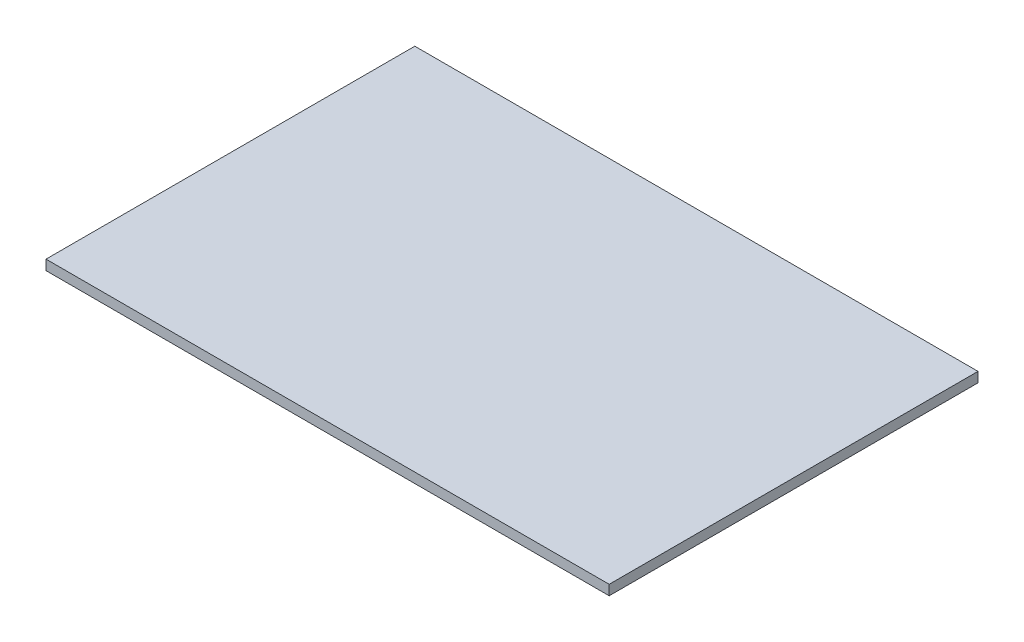
ISO-10303-21;
HEADER;
FILE_DESCRIPTION(('STEP AP214'),'2;1');
FILE_NAME('part.step','',(''),(''),'','','');
FILE_SCHEMA(('AUTOMOTIVE_DESIGN { 1 0 10303 214 1 1 1 1 }'));
ENDSEC;
DATA;
#1=APPLICATION_CONTEXT('core data for automotive mechanical design processes');
#2=APPLICATION_PROTOCOL_DEFINITION('international standard','automotive_design',2000,#1);
#3=PRODUCT_CONTEXT('',#1,'mechanical');
#4=PRODUCT('Part','Part','',(#3));
#5=PRODUCT_RELATED_PRODUCT_CATEGORY('part','',(#4));
#6=PRODUCT_DEFINITION_FORMATION('','',#4);
#7=PRODUCT_DEFINITION_CONTEXT('part definition',#1,'design');
#8=PRODUCT_DEFINITION('design','',#6,#7);
#9=PRODUCT_DEFINITION_SHAPE('','',#8);
#10=(LENGTH_UNIT() NAMED_UNIT(*) SI_UNIT(.MILLI.,.METRE.));
#11=(NAMED_UNIT(*) PLANE_ANGLE_UNIT() SI_UNIT($,.RADIAN.));
#12=(NAMED_UNIT(*) SI_UNIT($,.STERADIAN.) SOLID_ANGLE_UNIT());
#13=UNCERTAINTY_MEASURE_WITH_UNIT(LENGTH_MEASURE(1.E-05),#10,'distance_accuracy_value','');
#14=(GEOMETRIC_REPRESENTATION_CONTEXT(3) GLOBAL_UNCERTAINTY_ASSIGNED_CONTEXT((#13)) GLOBAL_UNIT_ASSIGNED_CONTEXT((#10,
#11,#12)) REPRESENTATION_CONTEXT('',''));
#15=CARTESIAN_POINT('',(0.,0.,0.));
#16=DIRECTION('',(0.,0.,1.));
#17=DIRECTION('',(1.,0.,0.));
#18=AXIS2_PLACEMENT_3D('',#15,#16,#17);
#19=CARTESIAN_POINT('',(282.5,10.,185.));
#20=DIRECTION('',(-1.,0.,0.));
#21=DIRECTION('',(0.,0.,1.));
#22=AXIS2_PLACEMENT_3D('',#19,#20,#21);
#23=PLANE('',#22);
#24=DIRECTION('',(0.,0.,-1.));
#25=VECTOR('',#24,1.);
#26=CARTESIAN_POINT('',(282.5,0.,185.));
#27=LINE('',#26,#25);
#28=CARTESIAN_POINT('',(282.5,0.,185.));
#29=VERTEX_POINT('',#28);
#30=CARTESIAN_POINT('',(282.5,0.,-185.));
#31=VERTEX_POINT('',#30);
#32=EDGE_CURVE('E96',#29,#31,#27,.T.);
#33=ORIENTED_EDGE('',*,*,#32,.T.);
#34=DIRECTION('',(0.,-1.,0.));
#35=VECTOR('',#34,1.);
#36=CARTESIAN_POINT('',(282.5,10.,-185.));
#37=LINE('',#36,#35);
#38=CARTESIAN_POINT('',(282.5,10.,-185.));
#39=VERTEX_POINT('',#38);
#40=EDGE_CURVE('E11',#39,#31,#37,.T.);
#41=ORIENTED_EDGE('',*,*,#40,.F.);
#42=DIRECTION('',(0.,0.,-1.));
#43=VECTOR('',#42,1.);
#44=CARTESIAN_POINT('',(282.5,10.,185.));
#45=LINE('',#44,#43);
#46=CARTESIAN_POINT('',(282.5,10.,185.));
#47=VERTEX_POINT('',#46);
#48=EDGE_CURVE('E84',#47,#39,#45,.T.);
#49=ORIENTED_EDGE('',*,*,#48,.F.);
#50=DIRECTION('',(0.,-1.,0.));
#51=VECTOR('',#50,1.);
#52=CARTESIAN_POINT('',(282.5,10.,185.));
#53=LINE('',#52,#51);
#54=EDGE_CURVE('E92',#47,#29,#53,.T.);
#55=ORIENTED_EDGE('',*,*,#54,.T.);
#56=EDGE_LOOP('',(#33,#41,#49,#55));
#57=FACE_BOUND('',#56,.T.);
#58=ADVANCED_FACE('F33',(#57),#23,.F.);
#59=CARTESIAN_POINT('',(-282.5,10.,-185.));
#60=DIRECTION('',(0.,0.,1.));
#61=DIRECTION('',(1.,0.,0.));
#62=AXIS2_PLACEMENT_3D('',#59,#60,#61);
#63=PLANE('',#62);
#64=DIRECTION('',(-1.,0.,0.));
#65=VECTOR('',#64,1.);
#66=CARTESIAN_POINT('',(-282.5,0.,-185.));
#67=LINE('',#66,#65);
#68=CARTESIAN_POINT('',(-282.5,0.,-185.));
#69=VERTEX_POINT('',#68);
#70=EDGE_CURVE('E88',#31,#69,#67,.T.);
#71=ORIENTED_EDGE('',*,*,#70,.T.);
#72=DIRECTION('',(0.,-1.,0.));
#73=VECTOR('',#72,1.);
#74=CARTESIAN_POINT('',(-282.5,10.,-185.));
#75=LINE('',#74,#73);
#76=CARTESIAN_POINT('',(-282.5,10.,-185.));
#77=VERTEX_POINT('',#76);
#78=EDGE_CURVE('E41',#77,#69,#75,.T.);
#79=ORIENTED_EDGE('',*,*,#78,.F.);
#80=DIRECTION('',(-1.,0.,0.));
#81=VECTOR('',#80,1.);
#82=CARTESIAN_POINT('',(-282.5,10.,-185.));
#83=LINE('',#82,#81);
#84=EDGE_CURVE('E79',#39,#77,#83,.T.);
#85=ORIENTED_EDGE('',*,*,#84,.F.);
#86=ORIENTED_EDGE('',*,*,#40,.T.);
#87=EDGE_LOOP('',(#71,#79,#85,#86));
#88=FACE_BOUND('',#87,.T.);
#89=ADVANCED_FACE('F87',(#88),#63,.F.);
#90=CARTESIAN_POINT('',(-282.5,10.,185.));
#91=DIRECTION('',(1.,0.,0.));
#92=DIRECTION('',(0.,0.,-1.));
#93=AXIS2_PLACEMENT_3D('',#90,#91,#92);
#94=PLANE('',#93);
#95=DIRECTION('',(0.,0.,1.));
#96=VECTOR('',#95,1.);
#97=CARTESIAN_POINT('',(-282.5,0.,185.));
#98=LINE('',#97,#96);
#99=CARTESIAN_POINT('',(-282.5,0.,185.));
#100=VERTEX_POINT('',#99);
#101=EDGE_CURVE('E66',#69,#100,#98,.T.);
#102=ORIENTED_EDGE('',*,*,#101,.T.);
#103=DIRECTION('',(0.,-1.,0.));
#104=VECTOR('',#103,1.);
#105=CARTESIAN_POINT('',(-282.5,10.,185.));
#106=LINE('',#105,#104);
#107=CARTESIAN_POINT('',(-282.5,10.,185.));
#108=VERTEX_POINT('',#107);
#109=EDGE_CURVE('E89',#108,#100,#106,.T.);
#110=ORIENTED_EDGE('',*,*,#109,.F.);
#111=DIRECTION('',(0.,0.,1.));
#112=VECTOR('',#111,1.);
#113=CARTESIAN_POINT('',(-282.5,10.,185.));
#114=LINE('',#113,#112);
#115=EDGE_CURVE('E82',#77,#108,#114,.T.);
#116=ORIENTED_EDGE('',*,*,#115,.F.);
#117=ORIENTED_EDGE('',*,*,#78,.T.);
#118=EDGE_LOOP('',(#102,#110,#116,#117));
#119=FACE_BOUND('',#118,.T.);
#120=ADVANCED_FACE('F90',(#119),#94,.F.);
#121=CARTESIAN_POINT('',(-282.5,10.,185.));
#122=DIRECTION('',(0.,0.,-1.));
#123=DIRECTION('',(-1.,0.,0.));
#124=AXIS2_PLACEMENT_3D('',#121,#122,#123);
#125=PLANE('',#124);
#126=DIRECTION('',(1.,0.,0.));
#127=VECTOR('',#126,1.);
#128=CARTESIAN_POINT('',(-282.5,0.,185.));
#129=LINE('',#128,#127);
#130=EDGE_CURVE('E72',#100,#29,#129,.T.);
#131=ORIENTED_EDGE('',*,*,#130,.T.);
#132=ORIENTED_EDGE('',*,*,#54,.F.);
#133=DIRECTION('',(1.,0.,0.));
#134=VECTOR('',#133,1.);
#135=CARTESIAN_POINT('',(-282.5,10.,185.));
#136=LINE('',#135,#134);
#137=EDGE_CURVE('E49',#108,#47,#136,.T.);
#138=ORIENTED_EDGE('',*,*,#137,.F.);
#139=ORIENTED_EDGE('',*,*,#109,.T.);
#140=EDGE_LOOP('',(#131,#132,#138,#139));
#141=FACE_BOUND('',#140,.T.);
#142=ADVANCED_FACE('F103',(#141),#125,.F.);
#143=CARTESIAN_POINT('',(0.,10.,0.));
#144=DIRECTION('',(0.,-1.,0.));
#145=DIRECTION('',(0.,0.,-1.));
#146=AXIS2_PLACEMENT_3D('',#143,#144,#145);
#147=PLANE('',#146);
#148=ORIENTED_EDGE('',*,*,#48,.T.);
#149=ORIENTED_EDGE('',*,*,#84,.T.);
#150=ORIENTED_EDGE('',*,*,#115,.T.);
#151=ORIENTED_EDGE('',*,*,#137,.T.);
#152=EDGE_LOOP('',(#148,#149,#150,#151));
#153=FACE_BOUND('',#152,.T.);
#154=ADVANCED_FACE('F80',(#153),#147,.F.);
#155=CARTESIAN_POINT('',(0.,0.,0.));
#156=DIRECTION('',(0.,-1.,0.));
#157=DIRECTION('',(0.,0.,-1.));
#158=AXIS2_PLACEMENT_3D('',#155,#156,#157);
#159=PLANE('',#158);
#160=ORIENTED_EDGE('',*,*,#32,.F.);
#161=ORIENTED_EDGE('',*,*,#130,.F.);
#162=ORIENTED_EDGE('',*,*,#101,.F.);
#163=ORIENTED_EDGE('',*,*,#70,.F.);
#164=EDGE_LOOP('',(#160,#161,#162,#163));
#165=FACE_BOUND('',#164,.T.);
#166=ADVANCED_FACE('F106',(#165),#159,.T.);
#167=CLOSED_SHELL('',(#58,#89,#120,#142,#154,#166));
#168=MANIFOLD_SOLID_BREP('B2',#167);
#169=ADVANCED_BREP_SHAPE_REPRESENTATION('',(#18,#168),#14);
#170=SHAPE_DEFINITION_REPRESENTATION(#9,#169);
ENDSEC;
END-ISO-10303-21;
